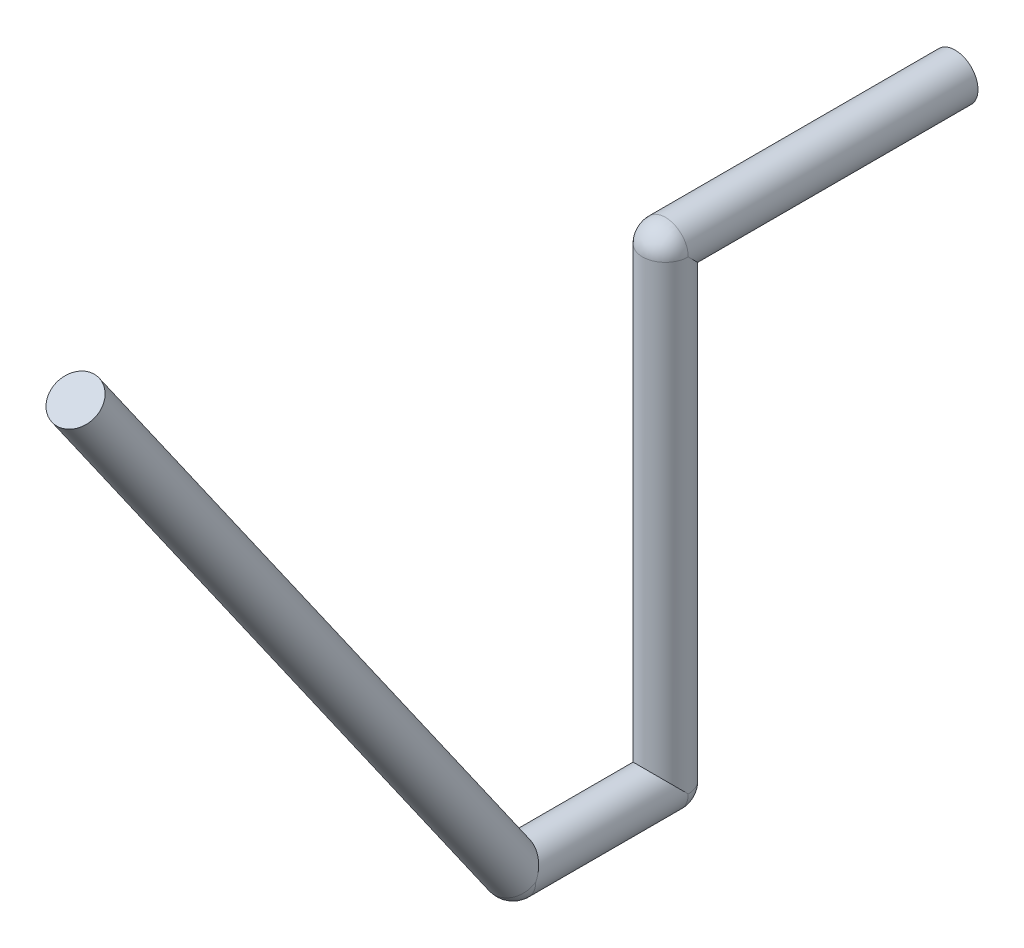
ISO-10303-21;
HEADER;
FILE_DESCRIPTION(('STEP AP214'),'2;1');
FILE_NAME('part.step','',(''),(''),'','','');
FILE_SCHEMA(('AUTOMOTIVE_DESIGN { 1 0 10303 214 1 1 1 1 }'));
ENDSEC;
DATA;
#1=APPLICATION_CONTEXT('core data for automotive mechanical design processes');
#2=APPLICATION_PROTOCOL_DEFINITION('international standard','automotive_design',2000,#1);
#3=PRODUCT_CONTEXT('',#1,'mechanical');
#4=PRODUCT('Part','Part','',(#3));
#5=PRODUCT_RELATED_PRODUCT_CATEGORY('part','',(#4));
#6=PRODUCT_DEFINITION_FORMATION('','',#4);
#7=PRODUCT_DEFINITION_CONTEXT('part definition',#1,'design');
#8=PRODUCT_DEFINITION('design','',#6,#7);
#9=PRODUCT_DEFINITION_SHAPE('','',#8);
#10=(LENGTH_UNIT() NAMED_UNIT(*) SI_UNIT(.MILLI.,.METRE.));
#11=(NAMED_UNIT(*) PLANE_ANGLE_UNIT() SI_UNIT($,.RADIAN.));
#12=(NAMED_UNIT(*) SI_UNIT($,.STERADIAN.) SOLID_ANGLE_UNIT());
#13=UNCERTAINTY_MEASURE_WITH_UNIT(LENGTH_MEASURE(1.E-05),#10,'distance_accuracy_value','');
#14=(GEOMETRIC_REPRESENTATION_CONTEXT(3) GLOBAL_UNCERTAINTY_ASSIGNED_CONTEXT((#13)) GLOBAL_UNIT_ASSIGNED_CONTEXT((#10,
#11,#12)) REPRESENTATION_CONTEXT('',''));
#15=CARTESIAN_POINT('',(0.,0.,0.));
#16=DIRECTION('',(0.,0.,1.));
#17=DIRECTION('',(1.,0.,0.));
#18=AXIS2_PLACEMENT_3D('',#15,#16,#17);
#19=CARTESIAN_POINT('',(0.6,10.4,-2.5));
#20=DIRECTION('',(0.,0.,1.));
#21=DIRECTION('',(1.,0.,0.));
#22=AXIS2_PLACEMENT_3D('',#19,#20,#21);
#23=PLANE('',#22);
#24=CARTESIAN_POINT('',(0.6,10.4,-2.5));
#25=DIRECTION('',(0.,0.,1.));
#26=DIRECTION('',(1.,0.,0.));
#27=AXIS2_PLACEMENT_3D('',#24,#25,#26);
#28=CIRCLE('',#27,0.3);
#29=CARTESIAN_POINT('',(0.9,10.4,-2.5));
#30=VERTEX_POINT('',#29);
#31=EDGE_CURVE('E19',#30,#30,#28,.T.);
#32=ORIENTED_EDGE('',*,*,#31,.F.);
#33=EDGE_LOOP('',(#32));
#34=FACE_BOUND('',#33,.T.);
#35=ADVANCED_FACE('F16',(#34),#23,.F.);
#36=CARTESIAN_POINT('',(0.6,10.4,1.3));
#37=DIRECTION('',(1.,0.,0.));
#38=DIRECTION('',(0.,1.,0.));
#39=AXIS2_PLACEMENT_3D('',#36,#37,#38);
#40=SPHERICAL_SURFACE('',#39,0.3);
#41=CARTESIAN_POINT('',(0.6,10.4,1.3));
#42=DIRECTION('',(0.,-1.,0.));
#43=DIRECTION('',(0.,0.,-1.));
#44=AXIS2_PLACEMENT_3D('',#41,#42,#43);
#45=CIRCLE('',#44,0.3);
#46=CARTESIAN_POINT('',(0.9,10.4,1.3));
#47=VERTEX_POINT('',#46);
#48=CARTESIAN_POINT('',(0.3,10.4,1.3));
#49=VERTEX_POINT('',#48);
#50=EDGE_CURVE('E50',#47,#49,#45,.T.);
#51=ORIENTED_EDGE('',*,*,#50,.F.);
#52=CARTESIAN_POINT('',(0.6,10.4,1.3));
#53=DIRECTION('',(0.,0.,1.));
#54=DIRECTION('',(1.,0.,0.));
#55=AXIS2_PLACEMENT_3D('',#52,#53,#54);
#56=CIRCLE('',#55,0.3);
#57=EDGE_CURVE('E47',#49,#47,#56,.F.);
#58=ORIENTED_EDGE('',*,*,#57,.F.);
#59=EDGE_LOOP('',(#51,#58));
#60=FACE_BOUND('',#59,.T.);
#61=ADVANCED_FACE('F51',(#60),#40,.T.);
#62=CARTESIAN_POINT('',(0.6,10.4,-2.5));
#63=DIRECTION('',(0.,0.,1.));
#64=DIRECTION('',(1.,0.,0.));
#65=AXIS2_PLACEMENT_3D('',#62,#63,#64);
#66=CYLINDRICAL_SURFACE('',#65,0.3);
#67=ORIENTED_EDGE('',*,*,#57,.T.);
#68=CARTESIAN_POINT('',(0.6,10.4,1.3));
#69=DIRECTION('',(0.,-0.707106781186548,0.707106781186547));
#70=DIRECTION('',(0.,-0.707106781186547,-0.707106781186548));
#71=AXIS2_PLACEMENT_3D('',#68,#69,#70);
#72=ELLIPSE('',#71,0.424264068711929,0.3);
#73=EDGE_CURVE('E54',#49,#47,#72,.T.);
#74=ORIENTED_EDGE('',*,*,#73,.F.);
#75=EDGE_LOOP('',(#67,#74));
#76=FACE_BOUND('',#75,.T.);
#77=ORIENTED_EDGE('',*,*,#31,.T.);
#78=EDGE_LOOP('',(#77));
#79=FACE_BOUND('',#78,.T.);
#80=ADVANCED_FACE('F57',(#76,#79),#66,.T.);
#81=CARTESIAN_POINT('',(0.6,10.4,1.3));
#82=DIRECTION('',(0.,-1.,0.));
#83=DIRECTION('',(0.,0.,-1.));
#84=AXIS2_PLACEMENT_3D('',#81,#82,#83);
#85=CYLINDRICAL_SURFACE('',#84,0.3);
#86=CARTESIAN_POINT('',(0.6,4.3,1.3));
#87=DIRECTION('',(0.,-0.707106781186548,0.707106781186547));
#88=DIRECTION('',(0.,0.707106781186547,0.707106781186548));
#89=AXIS2_PLACEMENT_3D('',#86,#87,#88);
#90=ELLIPSE('',#89,0.424264068711929,0.3);
#91=CARTESIAN_POINT('',(0.9,4.3,1.3));
#92=VERTEX_POINT('',#91);
#93=CARTESIAN_POINT('',(0.3,4.3,1.3));
#94=VERTEX_POINT('',#93);
#95=EDGE_CURVE('E62',#92,#94,#90,.T.);
#96=ORIENTED_EDGE('',*,*,#95,.F.);
#97=CARTESIAN_POINT('',(0.6,4.3,1.3));
#98=DIRECTION('',(0.,1.,0.));
#99=DIRECTION('',(1.,0.,0.));
#100=AXIS2_PLACEMENT_3D('',#97,#98,#99);
#101=CIRCLE('',#100,0.3);
#102=EDGE_CURVE('E61',#94,#92,#101,.F.);
#103=ORIENTED_EDGE('',*,*,#102,.F.);
#104=EDGE_LOOP('',(#96,#103));
#105=FACE_BOUND('',#104,.T.);
#106=ORIENTED_EDGE('',*,*,#73,.T.);
#107=ORIENTED_EDGE('',*,*,#50,.T.);
#108=EDGE_LOOP('',(#106,#107));
#109=FACE_BOUND('',#108,.T.);
#110=ADVANCED_FACE('F60',(#105,#109),#85,.T.);
#111=CARTESIAN_POINT('',(0.6,4.3,1.3));
#112=DIRECTION('',(1.,0.,0.));
#113=DIRECTION('',(0.,1.,0.));
#114=AXIS2_PLACEMENT_3D('',#111,#112,#113);
#115=SPHERICAL_SURFACE('',#114,0.3);
#116=CARTESIAN_POINT('',(0.6,4.3,1.3));
#117=DIRECTION('',(0.,0.,1.));
#118=DIRECTION('',(1.,0.,0.));
#119=AXIS2_PLACEMENT_3D('',#116,#117,#118);
#120=CIRCLE('',#119,0.3);
#121=EDGE_CURVE('E67',#94,#92,#120,.T.);
#122=ORIENTED_EDGE('',*,*,#121,.F.);
#123=ORIENTED_EDGE('',*,*,#102,.T.);
#124=EDGE_LOOP('',(#122,#123));
#125=FACE_BOUND('',#124,.T.);
#126=ADVANCED_FACE('F79',(#125),#115,.T.);
#127=CARTESIAN_POINT('',(0.6,4.3,1.3));
#128=DIRECTION('',(0.,0.,1.));
#129=DIRECTION('',(1.,0.,0.));
#130=AXIS2_PLACEMENT_3D('',#127,#128,#129);
#131=CYLINDRICAL_SURFACE('',#130,0.3);
#132=ORIENTED_EDGE('',*,*,#121,.T.);
#133=ORIENTED_EDGE('',*,*,#95,.T.);
#134=EDGE_LOOP('',(#132,#133));
#135=FACE_BOUND('',#134,.T.);
#136=CARTESIAN_POINT('',(0.6,4.3,3.3));
#137=DIRECTION('',(0.,-1.22658664407386E-11,-1.));
#138=DIRECTION('',(1.,0.,0.));
#139=AXIS2_PLACEMENT_3D('',#136,#137,#138);
#140=CIRCLE('',#139,0.3);
#141=CARTESIAN_POINT('',(0.3,4.3,3.3));
#142=VERTEX_POINT('',#141);
#143=CARTESIAN_POINT('',(0.9,4.3,3.3));
#144=VERTEX_POINT('',#143);
#145=EDGE_CURVE('E33',#142,#144,#140,.F.);
#146=ORIENTED_EDGE('',*,*,#145,.F.);
#147=CARTESIAN_POINT('',(0.6,4.3,3.3));
#148=DIRECTION('',(0.,0.461748613235053,0.887010833178212));
#149=DIRECTION('',(0.,0.887010833178212,-0.461748613235053));
#150=AXIS2_PLACEMENT_3D('',#147,#148,#149);
#151=ELLIPSE('',#150,0.338214584059906,0.3);
#152=EDGE_CURVE('E68',#144,#142,#151,.T.);
#153=ORIENTED_EDGE('',*,*,#152,.F.);
#154=EDGE_LOOP('',(#146,#153));
#155=FACE_BOUND('',#154,.T.);
#156=ADVANCED_FACE('F84',(#135,#155),#131,.T.);
#157=CARTESIAN_POINT('',(0.6,4.3,3.3));
#158=DIRECTION('',(1.,0.,0.));
#159=DIRECTION('',(0.,1.,0.));
#160=AXIS2_PLACEMENT_3D('',#157,#158,#159);
#161=SPHERICAL_SURFACE('',#160,0.3);
#162=ORIENTED_EDGE('',*,*,#145,.T.);
#163=CARTESIAN_POINT('',(0.6,4.3,3.3));
#164=DIRECTION('',(0.,0.819152044289016,0.573576436351011));
#165=DIRECTION('',(0.,-0.573576436351011,0.819152044289016));
#166=AXIS2_PLACEMENT_3D('',#163,#164,#165);
#167=CIRCLE('',#166,0.3);
#168=EDGE_CURVE('E25',#142,#144,#167,.T.);
#169=ORIENTED_EDGE('',*,*,#168,.F.);
#170=EDGE_LOOP('',(#162,#169));
#171=FACE_BOUND('',#170,.T.);
#172=ADVANCED_FACE('F97',(#171),#161,.T.);
#173=CARTESIAN_POINT('',(0.6,12.49152044289,9.03576436351));
#174=DIRECTION('',(0.,0.819152044289016,0.573576436351011));
#175=DIRECTION('',(0.,-0.573576436351011,0.819152044289016));
#176=AXIS2_PLACEMENT_3D('',#173,#174,#175);
#177=PLANE('',#176);
#178=CARTESIAN_POINT('',(0.6,12.49152044289,9.03576436351));
#179=DIRECTION('',(0.,0.819152044289016,0.573576436351011));
#180=DIRECTION('',(0.,-0.573576436351011,0.819152044289016));
#181=AXIS2_PLACEMENT_3D('',#178,#179,#180);
#182=CIRCLE('',#181,0.3);
#183=CARTESIAN_POINT('',(0.6,12.3194475119847,9.2815099767967));
#184=VERTEX_POINT('',#183);
#185=EDGE_CURVE('E11',#184,#184,#182,.F.);
#186=ORIENTED_EDGE('',*,*,#185,.F.);
#187=EDGE_LOOP('',(#186));
#188=FACE_BOUND('',#187,.T.);
#189=ADVANCED_FACE('F100',(#188),#177,.T.);
#190=CARTESIAN_POINT('',(0.6,4.3,3.3));
#191=DIRECTION('',(0.,0.819152044289016,0.573576436351011));
#192=DIRECTION('',(0.,-0.573576436351011,0.819152044289016));
#193=AXIS2_PLACEMENT_3D('',#190,#191,#192);
#194=CYLINDRICAL_SURFACE('',#193,0.3);
#195=ORIENTED_EDGE('',*,*,#185,.T.);
#196=EDGE_LOOP('',(#195));
#197=FACE_BOUND('',#196,.T.);
#198=ORIENTED_EDGE('',*,*,#168,.T.);
#199=ORIENTED_EDGE('',*,*,#152,.T.);
#200=EDGE_LOOP('',(#198,#199));
#201=FACE_BOUND('',#200,.T.);
#202=ADVANCED_FACE('F104',(#197,#201),#194,.T.);
#203=CLOSED_SHELL('',(#35,#61,#80,#110,#126,#156,#172,#189,#202));
#204=MANIFOLD_SOLID_BREP('B1',#203);
#205=ADVANCED_BREP_SHAPE_REPRESENTATION('',(#18,#204),#14);
#206=SHAPE_DEFINITION_REPRESENTATION(#9,#205);
ENDSEC;
END-ISO-10303-21;
